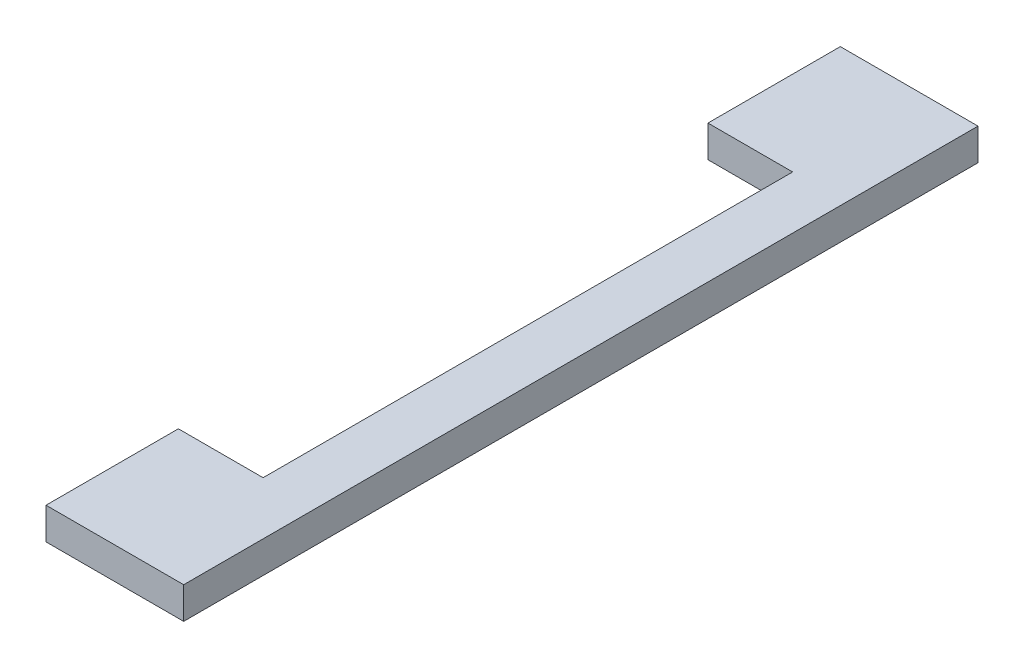
ISO-10303-21;
HEADER;
FILE_DESCRIPTION(('STEP AP214'),'2;1');
FILE_NAME('part.step','',(''),(''),'','','');
FILE_SCHEMA(('AUTOMOTIVE_DESIGN { 1 0 10303 214 1 1 1 1 }'));
ENDSEC;
DATA;
#1=APPLICATION_CONTEXT('core data for automotive mechanical design processes');
#2=APPLICATION_PROTOCOL_DEFINITION('international standard','automotive_design',2000,#1);
#3=PRODUCT_CONTEXT('',#1,'mechanical');
#4=PRODUCT('Part','Part','',(#3));
#5=PRODUCT_RELATED_PRODUCT_CATEGORY('part','',(#4));
#6=PRODUCT_DEFINITION_FORMATION('','',#4);
#7=PRODUCT_DEFINITION_CONTEXT('part definition',#1,'design');
#8=PRODUCT_DEFINITION('design','',#6,#7);
#9=PRODUCT_DEFINITION_SHAPE('','',#8);
#10=(LENGTH_UNIT() NAMED_UNIT(*) SI_UNIT(.MILLI.,.METRE.));
#11=(NAMED_UNIT(*) PLANE_ANGLE_UNIT() SI_UNIT($,.RADIAN.));
#12=(NAMED_UNIT(*) SI_UNIT($,.STERADIAN.) SOLID_ANGLE_UNIT());
#13=UNCERTAINTY_MEASURE_WITH_UNIT(LENGTH_MEASURE(1.E-05),#10,'distance_accuracy_value','');
#14=(GEOMETRIC_REPRESENTATION_CONTEXT(3) GLOBAL_UNCERTAINTY_ASSIGNED_CONTEXT((#13)) GLOBAL_UNIT_ASSIGNED_CONTEXT((#10,
#11,#12)) REPRESENTATION_CONTEXT('',''));
#15=CARTESIAN_POINT('',(0.,0.,0.));
#16=DIRECTION('',(0.,0.,1.));
#17=DIRECTION('',(1.,0.,0.));
#18=AXIS2_PLACEMENT_3D('',#15,#16,#17);
#19=CARTESIAN_POINT('',(-17.4,6.,-105.26));
#20=DIRECTION('',(1.,0.,0.));
#21=DIRECTION('',(0.,0.,-1.));
#22=AXIS2_PLACEMENT_3D('',#19,#20,#21);
#23=PLANE('',#22);
#24=DIRECTION('',(0.,0.,1.));
#25=VECTOR('',#24,1.);
#26=CARTESIAN_POINT('',(-17.4,0.,-105.26));
#27=LINE('',#26,#25);
#28=CARTESIAN_POINT('',(-17.4,0.,-105.26));
#29=VERTEX_POINT('',#28);
#30=CARTESIAN_POINT('',(-17.4,0.,-80.26));
#31=VERTEX_POINT('',#30);
#32=EDGE_CURVE('E208',#29,#31,#27,.T.);
#33=ORIENTED_EDGE('',*,*,#32,.T.);
#34=DIRECTION('',(0.,-1.,0.));
#35=VECTOR('',#34,1.);
#36=CARTESIAN_POINT('',(-17.4,6.,-80.26));
#37=LINE('',#36,#35);
#38=CARTESIAN_POINT('',(-17.4,6.,-80.26));
#39=VERTEX_POINT('',#38);
#40=EDGE_CURVE('E12',#39,#31,#37,.T.);
#41=ORIENTED_EDGE('',*,*,#40,.F.);
#42=DIRECTION('',(0.,0.,1.));
#43=VECTOR('',#42,1.);
#44=CARTESIAN_POINT('',(-17.4,6.,-105.26));
#45=LINE('',#44,#43);
#46=CARTESIAN_POINT('',(-17.4,6.,-105.26));
#47=VERTEX_POINT('',#46);
#48=EDGE_CURVE('E162',#47,#39,#45,.T.);
#49=ORIENTED_EDGE('',*,*,#48,.F.);
#50=DIRECTION('',(0.,-1.,0.));
#51=VECTOR('',#50,1.);
#52=CARTESIAN_POINT('',(-17.4,6.,-105.26));
#53=LINE('',#52,#51);
#54=EDGE_CURVE('E137',#47,#29,#53,.T.);
#55=ORIENTED_EDGE('',*,*,#54,.T.);
#56=EDGE_LOOP('',(#33,#41,#49,#55));
#57=FACE_BOUND('',#56,.T.);
#58=ADVANCED_FACE('F40',(#57),#23,.F.);
#59=CARTESIAN_POINT('',(-17.4,6.,-80.26));
#60=DIRECTION('',(0.,0.,-1.));
#61=DIRECTION('',(-1.,0.,0.));
#62=AXIS2_PLACEMENT_3D('',#59,#60,#61);
#63=PLANE('',#62);
#64=DIRECTION('',(1.,0.,0.));
#65=VECTOR('',#64,1.);
#66=CARTESIAN_POINT('',(-17.4,0.,-80.26));
#67=LINE('',#66,#65);
#68=CARTESIAN_POINT('',(-1.4,0.,-80.26));
#69=VERTEX_POINT('',#68);
#70=EDGE_CURVE('E199',#31,#69,#67,.T.);
#71=ORIENTED_EDGE('',*,*,#70,.T.);
#72=DIRECTION('',(0.,-1.,0.));
#73=VECTOR('',#72,1.);
#74=CARTESIAN_POINT('',(-1.4,6.,-80.26));
#75=LINE('',#74,#73);
#76=CARTESIAN_POINT('',(-1.4,6.,-80.26));
#77=VERTEX_POINT('',#76);
#78=EDGE_CURVE('E49',#77,#69,#75,.T.);
#79=ORIENTED_EDGE('',*,*,#78,.F.);
#80=DIRECTION('',(1.,0.,0.));
#81=VECTOR('',#80,1.);
#82=CARTESIAN_POINT('',(-17.4,6.,-80.26));
#83=LINE('',#82,#81);
#84=EDGE_CURVE('E100',#39,#77,#83,.T.);
#85=ORIENTED_EDGE('',*,*,#84,.F.);
#86=ORIENTED_EDGE('',*,*,#40,.T.);
#87=EDGE_LOOP('',(#71,#79,#85,#86));
#88=FACE_BOUND('',#87,.T.);
#89=ADVANCED_FACE('F230',(#88),#63,.F.);
#90=CARTESIAN_POINT('',(-1.4,6.,-80.26));
#91=DIRECTION('',(1.,0.,0.));
#92=DIRECTION('',(0.,0.,-1.));
#93=AXIS2_PLACEMENT_3D('',#90,#91,#92);
#94=PLANE('',#93);
#95=DIRECTION('',(0.,0.,1.));
#96=VECTOR('',#95,1.);
#97=CARTESIAN_POINT('',(-1.4,0.,-80.26));
#98=LINE('',#97,#96);
#99=CARTESIAN_POINT('',(-1.39999999999999,0.,19.74));
#100=VERTEX_POINT('',#99);
#101=EDGE_CURVE('E194',#69,#100,#98,.T.);
#102=ORIENTED_EDGE('',*,*,#101,.T.);
#103=DIRECTION('',(0.,-1.,0.));
#104=VECTOR('',#103,1.);
#105=CARTESIAN_POINT('',(-1.39999999999999,6.,19.74));
#106=LINE('',#105,#104);
#107=CARTESIAN_POINT('',(-1.39999999999999,6.,19.74));
#108=VERTEX_POINT('',#107);
#109=EDGE_CURVE('E184',#108,#100,#106,.T.);
#110=ORIENTED_EDGE('',*,*,#109,.F.);
#111=DIRECTION('',(0.,0.,1.));
#112=VECTOR('',#111,1.);
#113=CARTESIAN_POINT('',(-1.4,6.,-80.26));
#114=LINE('',#113,#112);
#115=EDGE_CURVE('E154',#77,#108,#114,.T.);
#116=ORIENTED_EDGE('',*,*,#115,.F.);
#117=ORIENTED_EDGE('',*,*,#78,.T.);
#118=EDGE_LOOP('',(#102,#110,#116,#117));
#119=FACE_BOUND('',#118,.T.);
#120=ADVANCED_FACE('F192',(#119),#94,.F.);
#121=CARTESIAN_POINT('',(-17.4,6.,19.74));
#122=DIRECTION('',(0.,0.,1.));
#123=DIRECTION('',(1.,0.,0.));
#124=AXIS2_PLACEMENT_3D('',#121,#122,#123);
#125=PLANE('',#124);
#126=DIRECTION('',(-1.,0.,0.));
#127=VECTOR('',#126,1.);
#128=CARTESIAN_POINT('',(-17.4,0.,19.74));
#129=LINE('',#128,#127);
#130=CARTESIAN_POINT('',(-17.4,0.,19.74));
#131=VERTEX_POINT('',#130);
#132=EDGE_CURVE('E201',#100,#131,#129,.T.);
#133=ORIENTED_EDGE('',*,*,#132,.T.);
#134=DIRECTION('',(0.,-1.,0.));
#135=VECTOR('',#134,1.);
#136=CARTESIAN_POINT('',(-17.4,6.,19.74));
#137=LINE('',#136,#135);
#138=CARTESIAN_POINT('',(-17.4,6.,19.74));
#139=VERTEX_POINT('',#138);
#140=EDGE_CURVE('E180',#139,#131,#137,.T.);
#141=ORIENTED_EDGE('',*,*,#140,.F.);
#142=DIRECTION('',(-1.,0.,0.));
#143=VECTOR('',#142,1.);
#144=CARTESIAN_POINT('',(-17.4,6.,19.74));
#145=LINE('',#144,#143);
#146=EDGE_CURVE('E150',#108,#139,#145,.T.);
#147=ORIENTED_EDGE('',*,*,#146,.F.);
#148=ORIENTED_EDGE('',*,*,#109,.T.);
#149=EDGE_LOOP('',(#133,#141,#147,#148));
#150=FACE_BOUND('',#149,.T.);
#151=ADVANCED_FACE('F237',(#150),#125,.F.);
#152=CARTESIAN_POINT('',(-17.4,6.,19.74));
#153=DIRECTION('',(1.,0.,0.));
#154=DIRECTION('',(0.,0.,-1.));
#155=AXIS2_PLACEMENT_3D('',#152,#153,#154);
#156=PLANE('',#155);
#157=DIRECTION('',(0.,0.,1.));
#158=VECTOR('',#157,1.);
#159=CARTESIAN_POINT('',(-17.4,0.,19.74));
#160=LINE('',#159,#158);
#161=CARTESIAN_POINT('',(-17.4,0.,44.74));
#162=VERTEX_POINT('',#161);
#163=EDGE_CURVE('E206',#131,#162,#160,.T.);
#164=ORIENTED_EDGE('',*,*,#163,.T.);
#165=DIRECTION('',(0.,-1.,0.));
#166=VECTOR('',#165,1.);
#167=CARTESIAN_POINT('',(-17.4,6.,44.74));
#168=LINE('',#167,#166);
#169=CARTESIAN_POINT('',(-17.4,6.,44.74));
#170=VERTEX_POINT('',#169);
#171=EDGE_CURVE('E130',#170,#162,#168,.T.);
#172=ORIENTED_EDGE('',*,*,#171,.F.);
#173=DIRECTION('',(0.,0.,1.));
#174=VECTOR('',#173,1.);
#175=CARTESIAN_POINT('',(-17.4,6.,19.74));
#176=LINE('',#175,#174);
#177=EDGE_CURVE('E119',#139,#170,#176,.T.);
#178=ORIENTED_EDGE('',*,*,#177,.F.);
#179=ORIENTED_EDGE('',*,*,#140,.T.);
#180=EDGE_LOOP('',(#164,#172,#178,#179));
#181=FACE_BOUND('',#180,.T.);
#182=ADVANCED_FACE('F214',(#181),#156,.F.);
#183=CARTESIAN_POINT('',(-17.4,6.,44.74));
#184=DIRECTION('',(0.,0.,-1.));
#185=DIRECTION('',(-1.,0.,0.));
#186=AXIS2_PLACEMENT_3D('',#183,#184,#185);
#187=PLANE('',#186);
#188=DIRECTION('',(1.,0.,0.));
#189=VECTOR('',#188,1.);
#190=CARTESIAN_POINT('',(-17.4,0.,44.74));
#191=LINE('',#190,#189);
#192=CARTESIAN_POINT('',(8.60000000000002,0.,44.74));
#193=VERTEX_POINT('',#192);
#194=EDGE_CURVE('E128',#162,#193,#191,.T.);
#195=ORIENTED_EDGE('',*,*,#194,.T.);
#196=DIRECTION('',(0.,-1.,0.));
#197=VECTOR('',#196,1.);
#198=CARTESIAN_POINT('',(8.60000000000002,6.,44.74));
#199=LINE('',#198,#197);
#200=CARTESIAN_POINT('',(8.60000000000002,6.,44.74));
#201=VERTEX_POINT('',#200);
#202=EDGE_CURVE('E125',#201,#193,#199,.T.);
#203=ORIENTED_EDGE('',*,*,#202,.F.);
#204=DIRECTION('',(1.,0.,0.));
#205=VECTOR('',#204,1.);
#206=CARTESIAN_POINT('',(-17.4,6.,44.74));
#207=LINE('',#206,#205);
#208=EDGE_CURVE('E113',#170,#201,#207,.T.);
#209=ORIENTED_EDGE('',*,*,#208,.F.);
#210=ORIENTED_EDGE('',*,*,#171,.T.);
#211=EDGE_LOOP('',(#195,#203,#209,#210));
#212=FACE_BOUND('',#211,.T.);
#213=ADVANCED_FACE('F126',(#212),#187,.F.);
#214=CARTESIAN_POINT('',(8.6,6.,-105.26));
#215=DIRECTION('',(-1.,0.,0.));
#216=DIRECTION('',(0.,0.,1.));
#217=AXIS2_PLACEMENT_3D('',#214,#215,#216);
#218=PLANE('',#217);
#219=DIRECTION('',(0.,0.,-1.));
#220=VECTOR('',#219,1.);
#221=CARTESIAN_POINT('',(8.6,0.,-105.26));
#222=LINE('',#221,#220);
#223=CARTESIAN_POINT('',(8.6,0.,-105.26));
#224=VERTEX_POINT('',#223);
#225=EDGE_CURVE('E86',#193,#224,#222,.T.);
#226=ORIENTED_EDGE('',*,*,#225,.T.);
#227=DIRECTION('',(0.,-1.,0.));
#228=VECTOR('',#227,1.);
#229=CARTESIAN_POINT('',(8.6,6.,-105.26));
#230=LINE('',#229,#228);
#231=CARTESIAN_POINT('',(8.6,6.,-105.26));
#232=VERTEX_POINT('',#231);
#233=EDGE_CURVE('E131',#232,#224,#230,.T.);
#234=ORIENTED_EDGE('',*,*,#233,.F.);
#235=DIRECTION('',(0.,0.,-1.));
#236=VECTOR('',#235,1.);
#237=CARTESIAN_POINT('',(8.6,6.,-105.26));
#238=LINE('',#237,#236);
#239=EDGE_CURVE('E117',#201,#232,#238,.T.);
#240=ORIENTED_EDGE('',*,*,#239,.F.);
#241=ORIENTED_EDGE('',*,*,#202,.T.);
#242=EDGE_LOOP('',(#226,#234,#240,#241));
#243=FACE_BOUND('',#242,.T.);
#244=ADVANCED_FACE('F133',(#243),#218,.F.);
#245=CARTESIAN_POINT('',(-17.4,6.,-105.26));
#246=DIRECTION('',(0.,0.,1.));
#247=DIRECTION('',(1.,0.,0.));
#248=AXIS2_PLACEMENT_3D('',#245,#246,#247);
#249=PLANE('',#248);
#250=DIRECTION('',(-1.,0.,0.));
#251=VECTOR('',#250,1.);
#252=CARTESIAN_POINT('',(-17.4,0.,-105.26));
#253=LINE('',#252,#251);
#254=EDGE_CURVE('E92',#224,#29,#253,.T.);
#255=ORIENTED_EDGE('',*,*,#254,.T.);
#256=ORIENTED_EDGE('',*,*,#54,.F.);
#257=DIRECTION('',(-1.,0.,0.));
#258=VECTOR('',#257,1.);
#259=CARTESIAN_POINT('',(-17.4,6.,-105.26));
#260=LINE('',#259,#258);
#261=EDGE_CURVE('E57',#232,#47,#260,.T.);
#262=ORIENTED_EDGE('',*,*,#261,.F.);
#263=ORIENTED_EDGE('',*,*,#233,.T.);
#264=EDGE_LOOP('',(#255,#256,#262,#263));
#265=FACE_BOUND('',#264,.T.);
#266=ADVANCED_FACE('F219',(#265),#249,.F.);
#267=CARTESIAN_POINT('',(0.,6.,0.));
#268=DIRECTION('',(0.,1.,0.));
#269=DIRECTION('',(0.,0.,1.));
#270=AXIS2_PLACEMENT_3D('',#267,#268,#269);
#271=PLANE('',#270);
#272=ORIENTED_EDGE('',*,*,#48,.T.);
#273=ORIENTED_EDGE('',*,*,#84,.T.);
#274=ORIENTED_EDGE('',*,*,#115,.T.);
#275=ORIENTED_EDGE('',*,*,#146,.T.);
#276=ORIENTED_EDGE('',*,*,#177,.T.);
#277=ORIENTED_EDGE('',*,*,#208,.T.);
#278=ORIENTED_EDGE('',*,*,#239,.T.);
#279=ORIENTED_EDGE('',*,*,#261,.T.);
#280=EDGE_LOOP('',(#272,#273,#274,#275,#276,#277,#278,#279));
#281=FACE_BOUND('',#280,.T.);
#282=ADVANCED_FACE('F115',(#281),#271,.T.);
#283=CARTESIAN_POINT('',(0.,0.,0.));
#284=DIRECTION('',(0.,1.,0.));
#285=DIRECTION('',(0.,0.,1.));
#286=AXIS2_PLACEMENT_3D('',#283,#284,#285);
#287=PLANE('',#286);
#288=ORIENTED_EDGE('',*,*,#32,.F.);
#289=ORIENTED_EDGE('',*,*,#254,.F.);
#290=ORIENTED_EDGE('',*,*,#225,.F.);
#291=ORIENTED_EDGE('',*,*,#194,.F.);
#292=ORIENTED_EDGE('',*,*,#163,.F.);
#293=ORIENTED_EDGE('',*,*,#132,.F.);
#294=ORIENTED_EDGE('',*,*,#101,.F.);
#295=ORIENTED_EDGE('',*,*,#70,.F.);
#296=EDGE_LOOP('',(#288,#289,#290,#291,#292,#293,#294,#295));
#297=FACE_BOUND('',#296,.T.);
#298=ADVANCED_FACE('F198',(#297),#287,.F.);
#299=CLOSED_SHELL('',(#58,#89,#120,#151,#182,#213,#244,#266,#282,#298));
#300=MANIFOLD_SOLID_BREP('B2',#299);
#301=ADVANCED_BREP_SHAPE_REPRESENTATION('',(#18,#300),#14);
#302=SHAPE_DEFINITION_REPRESENTATION(#9,#301);
ENDSEC;
END-ISO-10303-21;
